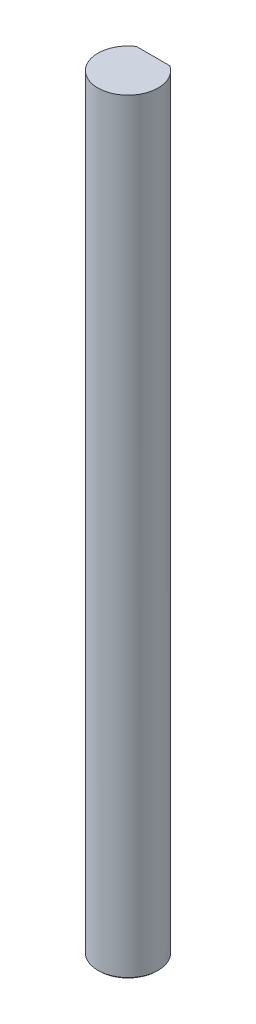
ISO-10303-21;
HEADER;
FILE_DESCRIPTION(('STEP AP214'),'2;1');
FILE_NAME('part.step','',(''),(''),'','','');
FILE_SCHEMA(('AUTOMOTIVE_DESIGN { 1 0 10303 214 1 1 1 1 }'));
ENDSEC;
DATA;
#1=APPLICATION_CONTEXT('core data for automotive mechanical design processes');
#2=APPLICATION_PROTOCOL_DEFINITION('international standard','automotive_design',2000,#1);
#3=PRODUCT_CONTEXT('',#1,'mechanical');
#4=PRODUCT('Part','Part','',(#3));
#5=PRODUCT_RELATED_PRODUCT_CATEGORY('part','',(#4));
#6=PRODUCT_DEFINITION_FORMATION('','',#4);
#7=PRODUCT_DEFINITION_CONTEXT('part definition',#1,'design');
#8=PRODUCT_DEFINITION('design','',#6,#7);
#9=PRODUCT_DEFINITION_SHAPE('','',#8);
#10=(LENGTH_UNIT() NAMED_UNIT(*) SI_UNIT(.MILLI.,.METRE.));
#11=(NAMED_UNIT(*) PLANE_ANGLE_UNIT() SI_UNIT($,.RADIAN.));
#12=(NAMED_UNIT(*) SI_UNIT($,.STERADIAN.) SOLID_ANGLE_UNIT());
#13=UNCERTAINTY_MEASURE_WITH_UNIT(LENGTH_MEASURE(1.E-05),#10,'distance_accuracy_value','');
#14=(GEOMETRIC_REPRESENTATION_CONTEXT(3) GLOBAL_UNCERTAINTY_ASSIGNED_CONTEXT((#13)) GLOBAL_UNIT_ASSIGNED_CONTEXT((#10,
#11,#12)) REPRESENTATION_CONTEXT('',''));
#15=CARTESIAN_POINT('',(0.,0.,0.));
#16=DIRECTION('',(0.,0.,1.));
#17=DIRECTION('',(1.,0.,0.));
#18=AXIS2_PLACEMENT_3D('',#15,#16,#17);
#19=CARTESIAN_POINT('',(0.,0.124999999999931,0.));
#20=DIRECTION('',(0.,1.,0.));
#21=DIRECTION('',(0.,0.,1.));
#22=AXIS2_PLACEMENT_3D('',#19,#20,#21);
#23=CONICAL_SURFACE('',#22,3.,0.785398163397438);
#24=CARTESIAN_POINT('',(0.,0.,0.));
#25=DIRECTION('',(0.,-1.,0.));
#26=DIRECTION('',(0.,0.,1.));
#27=AXIS2_PLACEMENT_3D('',#24,#25,#26);
#28=CIRCLE('',#27,2.87500000000008);
#29=CARTESIAN_POINT('',(0.,0.,2.87500000000008));
#30=VERTEX_POINT('',#29);
#31=CARTESIAN_POINT('',(-1.41972708645021,0.,-2.5));
#32=VERTEX_POINT('',#31);
#33=EDGE_CURVE('E69',#30,#32,#28,.T.);
#34=ORIENTED_EDGE('',*,*,#33,.F.);
#35=DIRECTION('',(0.,0.707106781186555,0.70710678118654));
#36=VECTOR('',#35,1.);
#37=CARTESIAN_POINT('',(0.,0.124999999999931,3.));
#38=LINE('',#37,#36);
#39=CARTESIAN_POINT('',(0.,0.124999999999931,3.));
#40=VERTEX_POINT('',#39);
#41=EDGE_CURVE('E11',#30,#40,#38,.T.);
#42=ORIENTED_EDGE('',*,*,#41,.T.);
#43=CARTESIAN_POINT('',(0.,0.124999999999931,0.));
#44=DIRECTION('',(0.,1.,0.));
#45=DIRECTION('',(0.,0.,1.));
#46=AXIS2_PLACEMENT_3D('',#43,#44,#45);
#47=CIRCLE('',#46,3.);
#48=CARTESIAN_POINT('',(-1.6583123951777,0.124999999999931,-2.5));
#49=VERTEX_POINT('',#48);
#50=EDGE_CURVE('E106',#49,#40,#47,.T.);
#51=ORIENTED_EDGE('',*,*,#50,.F.);
#52=CARTESIAN_POINT('',(-1.41972708645021,0.,-2.5));
#53=CARTESIAN_POINT('',(-1.50022900034248,0.0397533035352803,-2.5));
#54=CARTESIAN_POINT('',(-1.57973572193481,0.0815651095964097,-2.5));
#55=CARTESIAN_POINT('',(-1.6583123951777,0.124999999999931,-2.5));
#56=(BOUNDED_CURVE() B_SPLINE_CURVE(3,(#52,#53,#54,#55),.UNSPECIFIED.,.F.,
.F.) B_SPLINE_CURVE_WITH_KNOTS((4,4),(0.,0.000269347265700938),
.UNSPECIFIED.) CURVE() GEOMETRIC_REPRESENTATION_ITEM() RATIONAL_B_SPLINE_CURVE((1.,1.,1.,1.)) REPRESENTATION_ITEM(''));
#57=EDGE_CURVE('E113',#32,#49,#56,.T.);
#58=ORIENTED_EDGE('',*,*,#57,.F.);
#59=EDGE_LOOP('',(#34,#42,#51,#58));
#60=FACE_BOUND('',#59,.T.);
#61=ADVANCED_FACE('F38',(#60),#23,.T.);
#62=CARTESIAN_POINT('',(0.,300.,0.));
#63=DIRECTION('',(0.,-1.,0.));
#64=DIRECTION('',(0.,0.,-1.));
#65=AXIS2_PLACEMENT_3D('',#62,#63,#64);
#66=CYLINDRICAL_SURFACE('',#65,3.);
#67=CARTESIAN_POINT('',(0.,76.2,0.));
#68=DIRECTION('',(0.,-1.,0.));
#69=DIRECTION('',(1.,0.,0.));
#70=AXIS2_PLACEMENT_3D('',#67,#68,#69);
#71=CIRCLE('',#70,3.);
#72=CARTESIAN_POINT('',(-1.6583123951777,76.2,-2.5));
#73=VERTEX_POINT('',#72);
#74=CARTESIAN_POINT('',(1.6583123951777,76.2,-2.5));
#75=VERTEX_POINT('',#74);
#76=EDGE_CURVE('E57',#73,#75,#71,.F.);
#77=ORIENTED_EDGE('',*,*,#76,.F.);
#78=DIRECTION('',(0.,-1.,0.));
#79=VECTOR('',#78,1.);
#80=CARTESIAN_POINT('',(-1.6583123951777,300.,-2.5));
#81=LINE('',#80,#79);
#82=EDGE_CURVE('E50',#73,#49,#81,.T.);
#83=ORIENTED_EDGE('',*,*,#82,.T.);
#84=ORIENTED_EDGE('',*,*,#50,.T.);
#85=CARTESIAN_POINT('',(0.,0.124999999999931,0.));
#86=DIRECTION('',(0.,1.,0.));
#87=DIRECTION('',(0.,0.,1.));
#88=AXIS2_PLACEMENT_3D('',#85,#86,#87);
#89=CIRCLE('',#88,3.);
#90=CARTESIAN_POINT('',(1.6583123951777,0.124999999999931,-2.5));
#91=VERTEX_POINT('',#90);
#92=EDGE_CURVE('E102',#40,#91,#89,.T.);
#93=ORIENTED_EDGE('',*,*,#92,.T.);
#94=DIRECTION('',(0.,-1.,0.));
#95=VECTOR('',#94,1.);
#96=CARTESIAN_POINT('',(1.6583123951777,300.,-2.5));
#97=LINE('',#96,#95);
#98=EDGE_CURVE('E93',#75,#91,#97,.T.);
#99=ORIENTED_EDGE('',*,*,#98,.F.);
#100=EDGE_LOOP('',(#77,#83,#84,#93,#99));
#101=FACE_BOUND('',#100,.T.);
#102=ADVANCED_FACE('F104',(#101),#66,.T.);
#103=CARTESIAN_POINT('',(0.,300.,-2.5));
#104=DIRECTION('',(0.,0.,-1.));
#105=DIRECTION('',(0.,-1.,0.));
#106=AXIS2_PLACEMENT_3D('',#103,#104,#105);
#107=PLANE('',#106);
#108=DIRECTION('',(-1.,0.,0.));
#109=VECTOR('',#108,1.);
#110=CARTESIAN_POINT('',(-35.0480747676057,76.2,-2.5));
#111=LINE('',#110,#109);
#112=EDGE_CURVE('E100',#75,#73,#111,.T.);
#113=ORIENTED_EDGE('',*,*,#112,.F.);
#114=ORIENTED_EDGE('',*,*,#98,.T.);
#115=CARTESIAN_POINT('',(1.6583123951777,0.124999999999931,-2.5));
#116=CARTESIAN_POINT('',(1.5797357219348,0.0815651095964221,-2.5));
#117=CARTESIAN_POINT('',(1.50022900034249,0.0397533035352561,-2.5));
#118=CARTESIAN_POINT('',(1.41972708645021,0.,-2.5));
#119=(BOUNDED_CURVE() B_SPLINE_CURVE(3,(#115,#116,#117,#118),.UNSPECIFIED.,.F.,
.F.) B_SPLINE_CURVE_WITH_KNOTS((4,4),(0.,0.000269347265700939),
.UNSPECIFIED.) CURVE() GEOMETRIC_REPRESENTATION_ITEM() RATIONAL_B_SPLINE_CURVE((1.,1.,1.,1.)) REPRESENTATION_ITEM(''));
#120=CARTESIAN_POINT('',(1.41972708645021,0.,-2.5));
#121=VERTEX_POINT('',#120);
#122=EDGE_CURVE('E42',#91,#121,#119,.T.);
#123=ORIENTED_EDGE('',*,*,#122,.T.);
#124=DIRECTION('',(1.,0.,0.));
#125=VECTOR('',#124,1.);
#126=CARTESIAN_POINT('',(0.,0.,-2.5));
#127=LINE('',#126,#125);
#128=EDGE_CURVE('E119',#32,#121,#127,.T.);
#129=ORIENTED_EDGE('',*,*,#128,.F.);
#130=ORIENTED_EDGE('',*,*,#57,.T.);
#131=ORIENTED_EDGE('',*,*,#82,.F.);
#132=EDGE_LOOP('',(#113,#114,#123,#129,#130,#131));
#133=FACE_BOUND('',#132,.T.);
#134=ADVANCED_FACE('F95',(#133),#107,.T.);
#135=CARTESIAN_POINT('',(0.,0.,0.));
#136=DIRECTION('',(0.,1.,0.));
#137=DIRECTION('',(1.,0.,0.));
#138=AXIS2_PLACEMENT_3D('',#135,#136,#137);
#139=PLANE('',#138);
#140=ORIENTED_EDGE('',*,*,#128,.T.);
#141=CARTESIAN_POINT('',(0.,0.,0.));
#142=DIRECTION('',(0.,-1.,0.));
#143=DIRECTION('',(0.,0.,1.));
#144=AXIS2_PLACEMENT_3D('',#141,#142,#143);
#145=CIRCLE('',#144,2.87500000000008);
#146=EDGE_CURVE('E111',#121,#30,#145,.T.);
#147=ORIENTED_EDGE('',*,*,#146,.T.);
#148=ORIENTED_EDGE('',*,*,#33,.T.);
#149=EDGE_LOOP('',(#140,#147,#148));
#150=FACE_BOUND('',#149,.T.);
#151=ADVANCED_FACE('F144',(#150),#139,.F.);
#152=CARTESIAN_POINT('',(0.,0.124999999999931,0.));
#153=DIRECTION('',(0.,1.,0.));
#154=DIRECTION('',(0.,0.,1.));
#155=AXIS2_PLACEMENT_3D('',#152,#153,#154);
#156=CONICAL_SURFACE('',#155,3.,0.785398163397438);
#157=ORIENTED_EDGE('',*,*,#41,.F.);
#158=ORIENTED_EDGE('',*,*,#146,.F.);
#159=ORIENTED_EDGE('',*,*,#122,.F.);
#160=ORIENTED_EDGE('',*,*,#92,.F.);
#161=EDGE_LOOP('',(#157,#158,#159,#160));
#162=FACE_BOUND('',#161,.T.);
#163=ADVANCED_FACE('F40',(#162),#156,.T.);
#164=CARTESIAN_POINT('',(-35.0480747676057,76.2,3.));
#165=DIRECTION('',(0.,-1.,0.));
#166=DIRECTION('',(1.,0.,0.));
#167=AXIS2_PLACEMENT_3D('',#164,#165,#166);
#168=PLANE('',#167);
#169=ORIENTED_EDGE('',*,*,#76,.T.);
#170=ORIENTED_EDGE('',*,*,#112,.T.);
#171=EDGE_LOOP('',(#169,#170));
#172=FACE_BOUND('',#171,.T.);
#173=ADVANCED_FACE('F139',(#172),#168,.F.);
#174=CLOSED_SHELL('',(#61,#102,#134,#151,#163,#173));
#175=MANIFOLD_SOLID_BREP('B2',#174);
#176=ADVANCED_BREP_SHAPE_REPRESENTATION('',(#18,#175),#14);
#177=SHAPE_DEFINITION_REPRESENTATION(#9,#176);
ENDSEC;
END-ISO-10303-21;
